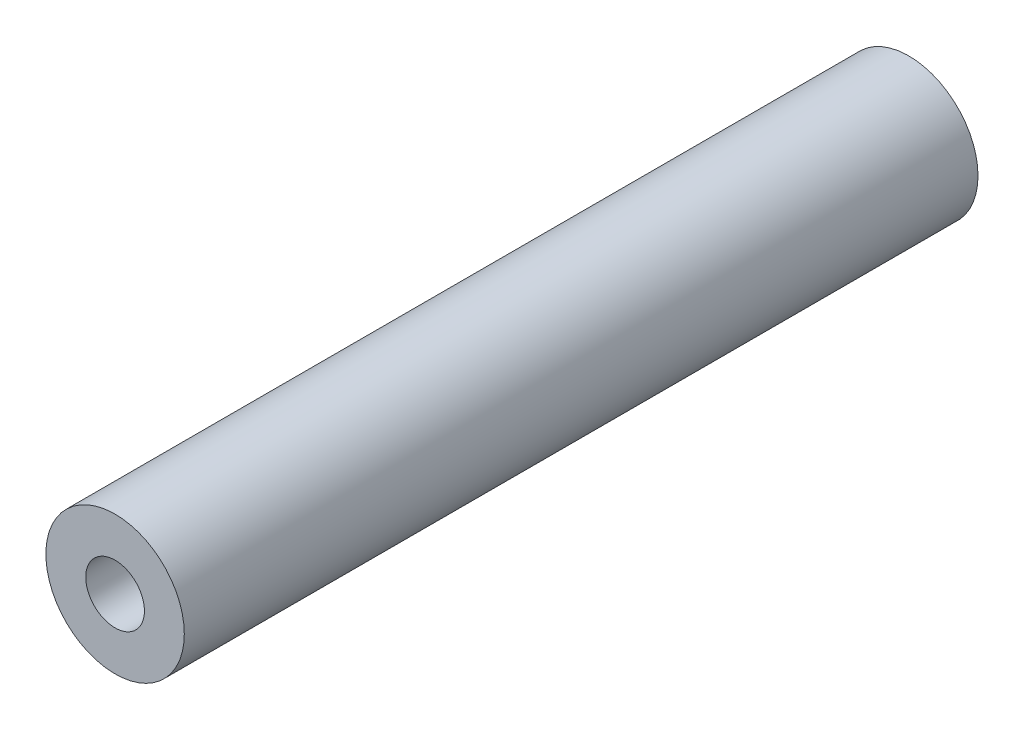
ISO-10303-21;
HEADER;
FILE_DESCRIPTION(('STEP AP214'),'2;1');
FILE_NAME('part.step','',(''),(''),'','','');
FILE_SCHEMA(('AUTOMOTIVE_DESIGN { 1 0 10303 214 1 1 1 1 }'));
ENDSEC;
DATA;
#1=APPLICATION_CONTEXT('core data for automotive mechanical design processes');
#2=APPLICATION_PROTOCOL_DEFINITION('international standard','automotive_design',2000,#1);
#3=PRODUCT_CONTEXT('',#1,'mechanical');
#4=PRODUCT('Part','Part','',(#3));
#5=PRODUCT_RELATED_PRODUCT_CATEGORY('part','',(#4));
#6=PRODUCT_DEFINITION_FORMATION('','',#4);
#7=PRODUCT_DEFINITION_CONTEXT('part definition',#1,'design');
#8=PRODUCT_DEFINITION('design','',#6,#7);
#9=PRODUCT_DEFINITION_SHAPE('','',#8);
#10=(LENGTH_UNIT() NAMED_UNIT(*) SI_UNIT(.MILLI.,.METRE.));
#11=(NAMED_UNIT(*) PLANE_ANGLE_UNIT() SI_UNIT($,.RADIAN.));
#12=(NAMED_UNIT(*) SI_UNIT($,.STERADIAN.) SOLID_ANGLE_UNIT());
#13=UNCERTAINTY_MEASURE_WITH_UNIT(LENGTH_MEASURE(1.E-05),#10,'distance_accuracy_value','');
#14=(GEOMETRIC_REPRESENTATION_CONTEXT(3) GLOBAL_UNCERTAINTY_ASSIGNED_CONTEXT((#13)) GLOBAL_UNIT_ASSIGNED_CONTEXT((#10,
#11,#12)) REPRESENTATION_CONTEXT('',''));
#15=CARTESIAN_POINT('',(0.,0.,0.));
#16=DIRECTION('',(0.,0.,1.));
#17=DIRECTION('',(1.,0.,0.));
#18=AXIS2_PLACEMENT_3D('',#15,#16,#17);
#19=CARTESIAN_POINT('',(-126.845846883905,144.36719939503,27.305));
#20=DIRECTION('',(0.,0.,-1.));
#21=DIRECTION('',(-1.,0.,0.));
#22=AXIS2_PLACEMENT_3D('',#19,#20,#21);
#23=CYLINDRICAL_SURFACE('',#22,4.7625);
#24=CARTESIAN_POINT('',(-126.845846883905,144.36719939503,27.305));
#25=DIRECTION('',(0.,0.,1.));
#26=DIRECTION('',(1.,0.,0.));
#27=AXIS2_PLACEMENT_3D('',#24,#25,#26);
#28=CIRCLE('',#27,4.7625);
#29=CARTESIAN_POINT('',(-122.083346883905,144.36719939503,27.305));
#30=VERTEX_POINT('',#29);
#31=EDGE_CURVE('E11',#30,#30,#28,.T.);
#32=ORIENTED_EDGE('',*,*,#31,.F.);
#33=EDGE_LOOP('',(#32));
#34=FACE_BOUND('',#33,.T.);
#35=CARTESIAN_POINT('',(-126.845846883905,144.36719939503,-27.305));
#36=DIRECTION('',(0.,0.,1.));
#37=DIRECTION('',(1.,0.,0.));
#38=AXIS2_PLACEMENT_3D('',#35,#36,#37);
#39=CIRCLE('',#38,4.7625);
#40=CARTESIAN_POINT('',(-122.083346883905,144.36719939503,-27.305));
#41=VERTEX_POINT('',#40);
#42=EDGE_CURVE('E46',#41,#41,#39,.T.);
#43=ORIENTED_EDGE('',*,*,#42,.T.);
#44=EDGE_LOOP('',(#43));
#45=FACE_BOUND('',#44,.T.);
#46=ADVANCED_FACE('F43',(#34,#45),#23,.T.);
#47=CARTESIAN_POINT('',(-126.845846883905,144.36719939503,27.305));
#48=DIRECTION('',(0.,0.,1.));
#49=DIRECTION('',(1.,0.,0.));
#50=AXIS2_PLACEMENT_3D('',#47,#48,#49);
#51=PLANE('',#50);
#52=CARTESIAN_POINT('',(-126.845846883905,144.36719939503,27.305));
#53=DIRECTION('',(0.,0.,1.));
#54=DIRECTION('',(1.,0.,0.));
#55=AXIS2_PLACEMENT_3D('',#52,#53,#54);
#56=CIRCLE('',#55,2.0193);
#57=CARTESIAN_POINT('',(-124.826546883905,144.36719939503,27.305));
#58=VERTEX_POINT('',#57);
#59=EDGE_CURVE('E67',#58,#58,#56,.T.);
#60=ORIENTED_EDGE('',*,*,#59,.F.);
#61=EDGE_LOOP('',(#60));
#62=FACE_BOUND('',#61,.T.);
#63=ORIENTED_EDGE('',*,*,#31,.T.);
#64=EDGE_LOOP('',(#63));
#65=FACE_BOUND('',#64,.T.);
#66=ADVANCED_FACE('F85',(#62,#65),#51,.T.);
#67=CARTESIAN_POINT('',(-126.845846883905,144.36719939503,-27.305));
#68=DIRECTION('',(0.,0.,1.));
#69=DIRECTION('',(1.,0.,0.));
#70=AXIS2_PLACEMENT_3D('',#67,#68,#69);
#71=PLANE('',#70);
#72=CARTESIAN_POINT('',(-126.845846883905,144.36719939503,-27.305));
#73=DIRECTION('',(0.,0.,-1.));
#74=DIRECTION('',(-1.,0.,0.));
#75=AXIS2_PLACEMENT_3D('',#72,#73,#74);
#76=CIRCLE('',#75,2.0193);
#77=CARTESIAN_POINT('',(-128.865146883905,144.36719939503,-27.305));
#78=VERTEX_POINT('',#77);
#79=EDGE_CURVE('E66',#78,#78,#76,.T.);
#80=ORIENTED_EDGE('',*,*,#79,.F.);
#81=EDGE_LOOP('',(#80));
#82=FACE_BOUND('',#81,.T.);
#83=ORIENTED_EDGE('',*,*,#42,.F.);
#84=EDGE_LOOP('',(#83));
#85=FACE_BOUND('',#84,.T.);
#86=ADVANCED_FACE('F82',(#82,#85),#71,.F.);
#87=CARTESIAN_POINT('',(-126.845846883905,144.36719939503,-15.27556));
#88=DIRECTION('',(0.,0.,-1.));
#89=DIRECTION('',(-1.,0.,0.));
#90=AXIS2_PLACEMENT_3D('',#87,#88,#89);
#91=CONICAL_SURFACE('',#90,2.0193,1.02974425867665);
#92=CARTESIAN_POINT('',(-126.845846883905,144.36719939503,-14.0622421519976));
#93=VERTEX_POINT('',#92);
#94=VERTEX_LOOP('',#93);
#95=FACE_BOUND('',#94,.T.);
#96=CARTESIAN_POINT('',(-126.845846883905,144.36719939503,-15.27556));
#97=DIRECTION('',(0.,0.,-1.));
#98=DIRECTION('',(-1.,0.,0.));
#99=AXIS2_PLACEMENT_3D('',#96,#97,#98);
#100=CIRCLE('',#99,2.0193);
#101=CARTESIAN_POINT('',(-128.865146883905,144.36719939503,-15.27556));
#102=VERTEX_POINT('',#101);
#103=EDGE_CURVE('E70',#102,#102,#100,.T.);
#104=ORIENTED_EDGE('',*,*,#103,.T.);
#105=EDGE_LOOP('',(#104));
#106=FACE_BOUND('',#105,.T.);
#107=ADVANCED_FACE('F84',(#95,#106),#91,.F.);
#108=CARTESIAN_POINT('',(-126.845846883905,144.36719939503,-27.305));
#109=DIRECTION('',(0.,0.,-1.));
#110=DIRECTION('',(-1.,0.,0.));
#111=AXIS2_PLACEMENT_3D('',#108,#109,#110);
#112=CYLINDRICAL_SURFACE('',#111,2.0193);
#113=ORIENTED_EDGE('',*,*,#103,.F.);
#114=EDGE_LOOP('',(#113));
#115=FACE_BOUND('',#114,.T.);
#116=ORIENTED_EDGE('',*,*,#79,.T.);
#117=EDGE_LOOP('',(#116));
#118=FACE_BOUND('',#117,.T.);
#119=ADVANCED_FACE('F60',(#115,#118),#112,.F.);
#120=CARTESIAN_POINT('',(-126.845846883905,144.36719939503,15.27556));
#121=DIRECTION('',(0.,0.,1.));
#122=DIRECTION('',(1.,0.,0.));
#123=AXIS2_PLACEMENT_3D('',#120,#121,#122);
#124=CONICAL_SURFACE('',#123,2.0193,1.02974425867665);
#125=CARTESIAN_POINT('',(-126.845846883905,144.36719939503,14.0622421519976));
#126=VERTEX_POINT('',#125);
#127=VERTEX_LOOP('',#126);
#128=FACE_BOUND('',#127,.T.);
#129=CARTESIAN_POINT('',(-126.845846883905,144.36719939503,15.27556));
#130=DIRECTION('',(0.,0.,1.));
#131=DIRECTION('',(1.,0.,0.));
#132=AXIS2_PLACEMENT_3D('',#129,#130,#131);
#133=CIRCLE('',#132,2.0193);
#134=CARTESIAN_POINT('',(-124.826546883905,144.36719939503,15.27556));
#135=VERTEX_POINT('',#134);
#136=EDGE_CURVE('E64',#135,#135,#133,.T.);
#137=ORIENTED_EDGE('',*,*,#136,.T.);
#138=EDGE_LOOP('',(#137));
#139=FACE_BOUND('',#138,.T.);
#140=ADVANCED_FACE('F56',(#128,#139),#124,.F.);
#141=CARTESIAN_POINT('',(-126.845846883905,144.36719939503,27.305));
#142=DIRECTION('',(0.,0.,1.));
#143=DIRECTION('',(1.,0.,0.));
#144=AXIS2_PLACEMENT_3D('',#141,#142,#143);
#145=CYLINDRICAL_SURFACE('',#144,2.0193);
#146=ORIENTED_EDGE('',*,*,#136,.F.);
#147=EDGE_LOOP('',(#146));
#148=FACE_BOUND('',#147,.T.);
#149=ORIENTED_EDGE('',*,*,#59,.T.);
#150=EDGE_LOOP('',(#149));
#151=FACE_BOUND('',#150,.T.);
#152=ADVANCED_FACE('F59',(#148,#151),#145,.F.);
#153=CLOSED_SHELL('',(#46,#66,#86,#107,#119,#140,#152));
#154=MANIFOLD_SOLID_BREP('B2',#153);
#155=ADVANCED_BREP_SHAPE_REPRESENTATION('',(#18,#154),#14);
#156=SHAPE_DEFINITION_REPRESENTATION(#9,#155);
ENDSEC;
END-ISO-10303-21;
